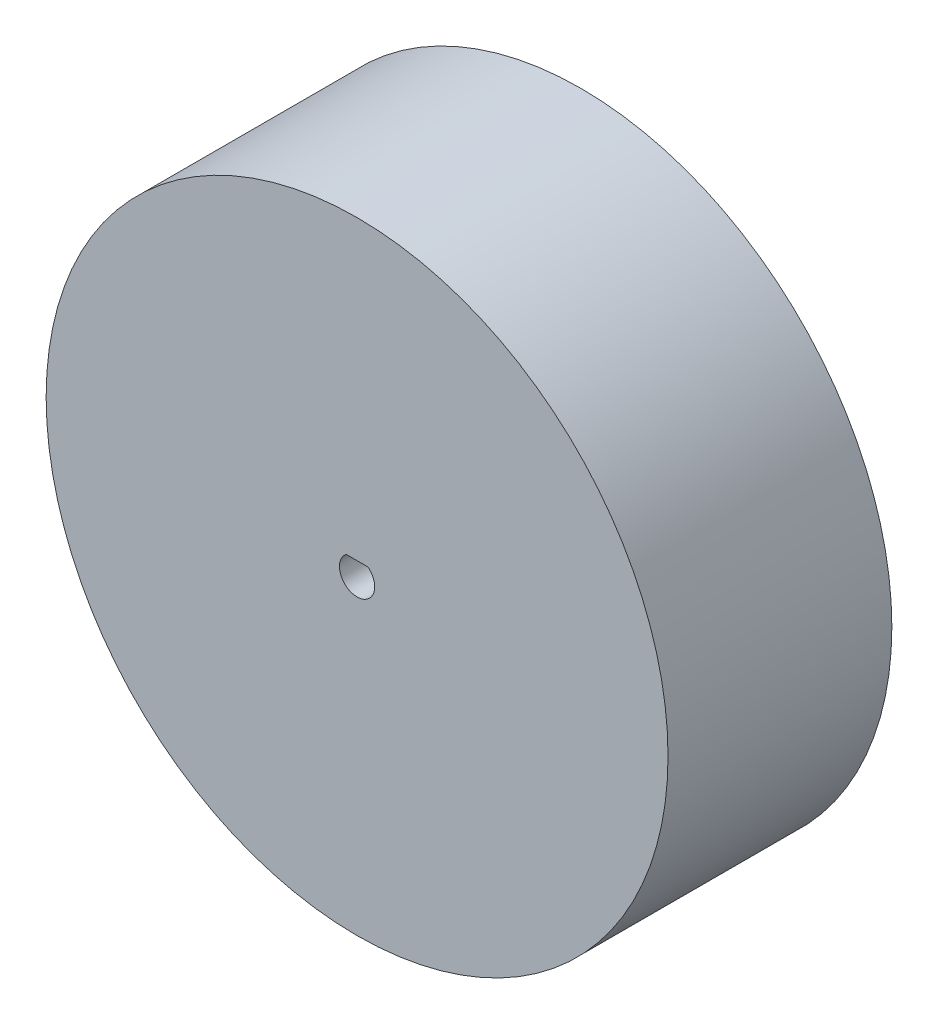
ISO-10303-21;
HEADER;
FILE_DESCRIPTION(('STEP AP214'),'2;1');
FILE_NAME('part.step','',(''),(''),'','','');
FILE_SCHEMA(('AUTOMOTIVE_DESIGN { 1 0 10303 214 1 1 1 1 }'));
ENDSEC;
DATA;
#1=APPLICATION_CONTEXT('core data for automotive mechanical design processes');
#2=APPLICATION_PROTOCOL_DEFINITION('international standard','automotive_design',2000,#1);
#3=PRODUCT_CONTEXT('',#1,'mechanical');
#4=PRODUCT('Part','Part','',(#3));
#5=PRODUCT_RELATED_PRODUCT_CATEGORY('part','',(#4));
#6=PRODUCT_DEFINITION_FORMATION('','',#4);
#7=PRODUCT_DEFINITION_CONTEXT('part definition',#1,'design');
#8=PRODUCT_DEFINITION('design','',#6,#7);
#9=PRODUCT_DEFINITION_SHAPE('','',#8);
#10=(LENGTH_UNIT() NAMED_UNIT(*) SI_UNIT(.MILLI.,.METRE.));
#11=(NAMED_UNIT(*) PLANE_ANGLE_UNIT() SI_UNIT($,.RADIAN.));
#12=(NAMED_UNIT(*) SI_UNIT($,.STERADIAN.) SOLID_ANGLE_UNIT());
#13=UNCERTAINTY_MEASURE_WITH_UNIT(LENGTH_MEASURE(1.E-05),#10,'distance_accuracy_value','');
#14=(GEOMETRIC_REPRESENTATION_CONTEXT(3) GLOBAL_UNCERTAINTY_ASSIGNED_CONTEXT((#13)) GLOBAL_UNIT_ASSIGNED_CONTEXT((#10,
#11,#12)) REPRESENTATION_CONTEXT('',''));
#15=CARTESIAN_POINT('',(0.,0.,0.));
#16=DIRECTION('',(0.,0.,1.));
#17=DIRECTION('',(1.,0.,0.));
#18=AXIS2_PLACEMENT_3D('',#15,#16,#17);
#19=CARTESIAN_POINT('',(0.,0.,26.));
#20=DIRECTION('',(0.,0.,1.));
#21=DIRECTION('',(1.,0.,0.));
#22=AXIS2_PLACEMENT_3D('',#19,#20,#21);
#23=PLANE('',#22);
#24=DIRECTION('',(-1.,0.,0.));
#25=VECTOR('',#24,1.);
#26=CARTESIAN_POINT('',(-1.27,1.60246625237476,26.));
#27=LINE('',#26,#25);
#28=CARTESIAN_POINT('',(1.27,1.60246625237476,26.));
#29=VERTEX_POINT('',#28);
#30=CARTESIAN_POINT('',(-1.27,1.60246625237476,26.));
#31=VERTEX_POINT('',#30);
#32=EDGE_CURVE('E74',#29,#31,#27,.T.);
#33=ORIENTED_EDGE('',*,*,#32,.F.);
#34=CARTESIAN_POINT('',(0.,0.,26.));
#35=DIRECTION('',(0.,0.,1.));
#36=DIRECTION('',(1.,0.,0.));
#37=AXIS2_PLACEMENT_3D('',#34,#35,#36);
#38=CIRCLE('',#37,2.0447);
#39=EDGE_CURVE('E62',#31,#29,#38,.T.);
#40=ORIENTED_EDGE('',*,*,#39,.F.);
#41=EDGE_LOOP('',(#33,#40));
#42=FACE_BOUND('',#41,.T.);
#43=CARTESIAN_POINT('',(0.,0.,26.));
#44=DIRECTION('',(0.,0.,1.));
#45=DIRECTION('',(1.,0.,0.));
#46=AXIS2_PLACEMENT_3D('',#43,#44,#45);
#47=CIRCLE('',#46,36.12);
#48=CARTESIAN_POINT('',(36.12,0.,26.));
#49=VERTEX_POINT('',#48);
#50=EDGE_CURVE('E71',#49,#49,#47,.T.);
#51=ORIENTED_EDGE('',*,*,#50,.T.);
#52=EDGE_LOOP('',(#51));
#53=FACE_BOUND('',#52,.T.);
#54=ADVANCED_FACE('F33',(#42,#53),#23,.T.);
#55=CARTESIAN_POINT('',(0.,0.,0.));
#56=DIRECTION('',(0.,0.,1.));
#57=DIRECTION('',(1.,0.,0.));
#58=AXIS2_PLACEMENT_3D('',#55,#56,#57);
#59=PLANE('',#58);
#60=CARTESIAN_POINT('',(0.,0.,0.));
#61=DIRECTION('',(0.,0.,1.));
#62=DIRECTION('',(1.,0.,0.));
#63=AXIS2_PLACEMENT_3D('',#60,#61,#62);
#64=CIRCLE('',#63,2.0447);
#65=CARTESIAN_POINT('',(-1.27,1.60246625237476,0.));
#66=VERTEX_POINT('',#65);
#67=CARTESIAN_POINT('',(1.27,1.60246625237476,0.));
#68=VERTEX_POINT('',#67);
#69=EDGE_CURVE('E53',#66,#68,#64,.T.);
#70=ORIENTED_EDGE('',*,*,#69,.T.);
#71=DIRECTION('',(-1.,0.,0.));
#72=VECTOR('',#71,1.);
#73=CARTESIAN_POINT('',(-1.27,1.60246625237476,0.));
#74=LINE('',#73,#72);
#75=EDGE_CURVE('E59',#68,#66,#74,.T.);
#76=ORIENTED_EDGE('',*,*,#75,.T.);
#77=EDGE_LOOP('',(#70,#76));
#78=FACE_BOUND('',#77,.T.);
#79=CARTESIAN_POINT('',(0.,0.,0.));
#80=DIRECTION('',(0.,0.,1.));
#81=DIRECTION('',(1.,0.,0.));
#82=AXIS2_PLACEMENT_3D('',#79,#80,#81);
#83=CIRCLE('',#82,36.12);
#84=CARTESIAN_POINT('',(36.12,0.,0.));
#85=VERTEX_POINT('',#84);
#86=EDGE_CURVE('E68',#85,#85,#83,.F.);
#87=ORIENTED_EDGE('',*,*,#86,.T.);
#88=EDGE_LOOP('',(#87));
#89=FACE_BOUND('',#88,.T.);
#90=ADVANCED_FACE('F35',(#78,#89),#59,.F.);
#91=CARTESIAN_POINT('',(0.,0.,26.));
#92=DIRECTION('',(0.,0.,-1.));
#93=DIRECTION('',(-1.,0.,0.));
#94=AXIS2_PLACEMENT_3D('',#91,#92,#93);
#95=CYLINDRICAL_SURFACE('',#94,2.0447);
#96=ORIENTED_EDGE('',*,*,#69,.F.);
#97=DIRECTION('',(0.,0.,-1.));
#98=VECTOR('',#97,1.);
#99=CARTESIAN_POINT('',(-1.27,1.60246625237476,26.));
#100=LINE('',#99,#98);
#101=EDGE_CURVE('E41',#31,#66,#100,.T.);
#102=ORIENTED_EDGE('',*,*,#101,.F.);
#103=ORIENTED_EDGE('',*,*,#39,.T.);
#104=DIRECTION('',(0.,0.,-1.));
#105=VECTOR('',#104,1.);
#106=CARTESIAN_POINT('',(1.27,1.60246625237476,26.));
#107=LINE('',#106,#105);
#108=EDGE_CURVE('E11',#29,#68,#107,.T.);
#109=ORIENTED_EDGE('',*,*,#108,.T.);
#110=EDGE_LOOP('',(#96,#102,#103,#109));
#111=FACE_BOUND('',#110,.T.);
#112=ADVANCED_FACE('F64',(#111),#95,.F.);
#113=CARTESIAN_POINT('',(-1.27,1.60246625237476,26.));
#114=DIRECTION('',(0.,-1.,0.));
#115=DIRECTION('',(0.,0.,-1.));
#116=AXIS2_PLACEMENT_3D('',#113,#114,#115);
#117=PLANE('',#116);
#118=ORIENTED_EDGE('',*,*,#75,.F.);
#119=ORIENTED_EDGE('',*,*,#108,.F.);
#120=ORIENTED_EDGE('',*,*,#32,.T.);
#121=ORIENTED_EDGE('',*,*,#101,.T.);
#122=EDGE_LOOP('',(#118,#119,#120,#121));
#123=FACE_BOUND('',#122,.T.);
#124=ADVANCED_FACE('F60',(#123),#117,.T.);
#125=CARTESIAN_POINT('',(0.,0.,-102.162787745832));
#126=DIRECTION('',(0.,0.,1.));
#127=DIRECTION('',(1.,0.,0.));
#128=AXIS2_PLACEMENT_3D('',#125,#126,#127);
#129=CYLINDRICAL_SURFACE('',#128,36.12);
#130=ORIENTED_EDGE('',*,*,#86,.F.);
#131=EDGE_LOOP('',(#130));
#132=FACE_BOUND('',#131,.T.);
#133=ORIENTED_EDGE('',*,*,#50,.F.);
#134=EDGE_LOOP('',(#133));
#135=FACE_BOUND('',#134,.T.);
#136=ADVANCED_FACE('F81',(#132,#135),#129,.T.);
#137=CLOSED_SHELL('',(#54,#90,#112,#124,#136));
#138=MANIFOLD_SOLID_BREP('B2',#137);
#139=ADVANCED_BREP_SHAPE_REPRESENTATION('',(#18,#138),#14);
#140=SHAPE_DEFINITION_REPRESENTATION(#9,#139);
ENDSEC;
END-ISO-10303-21;
